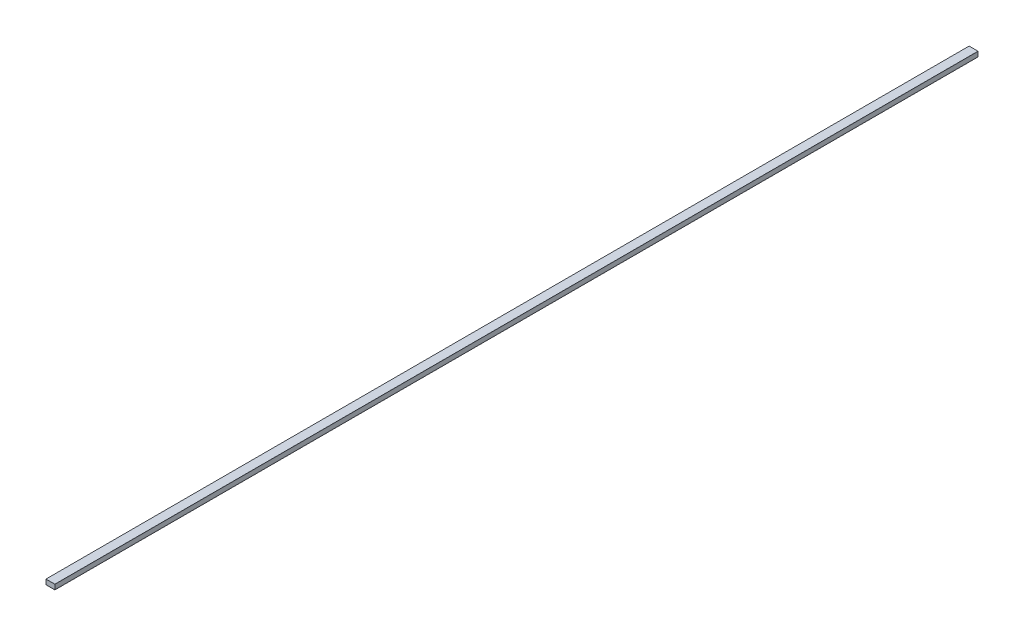
ISO-10303-21;
HEADER;
FILE_DESCRIPTION(('STEP AP214'),'2;1');
FILE_NAME('part.step','',(''),(''),'','','');
FILE_SCHEMA(('AUTOMOTIVE_DESIGN { 1 0 10303 214 1 1 1 1 }'));
ENDSEC;
DATA;
#1=APPLICATION_CONTEXT('core data for automotive mechanical design processes');
#2=APPLICATION_PROTOCOL_DEFINITION('international standard','automotive_design',2000,#1);
#3=PRODUCT_CONTEXT('',#1,'mechanical');
#4=PRODUCT('Part','Part','',(#3));
#5=PRODUCT_RELATED_PRODUCT_CATEGORY('part','',(#4));
#6=PRODUCT_DEFINITION_FORMATION('','',#4);
#7=PRODUCT_DEFINITION_CONTEXT('part definition',#1,'design');
#8=PRODUCT_DEFINITION('design','',#6,#7);
#9=PRODUCT_DEFINITION_SHAPE('','',#8);
#10=(LENGTH_UNIT() NAMED_UNIT(*) SI_UNIT(.MILLI.,.METRE.));
#11=(NAMED_UNIT(*) PLANE_ANGLE_UNIT() SI_UNIT($,.RADIAN.));
#12=(NAMED_UNIT(*) SI_UNIT($,.STERADIAN.) SOLID_ANGLE_UNIT());
#13=UNCERTAINTY_MEASURE_WITH_UNIT(LENGTH_MEASURE(1.E-05),#10,'distance_accuracy_value','');
#14=(GEOMETRIC_REPRESENTATION_CONTEXT(3) GLOBAL_UNCERTAINTY_ASSIGNED_CONTEXT((#13)) GLOBAL_UNIT_ASSIGNED_CONTEXT((#10,
#11,#12)) REPRESENTATION_CONTEXT('',''));
#15=CARTESIAN_POINT('',(0.,0.,0.));
#16=DIRECTION('',(0.,0.,1.));
#17=DIRECTION('',(1.,0.,0.));
#18=AXIS2_PLACEMENT_3D('',#15,#16,#17);
#19=CARTESIAN_POINT('',(-3.175,-1.787500108,329.946));
#20=DIRECTION('',(1.,0.,0.));
#21=DIRECTION('',(0.,1.,0.));
#22=AXIS2_PLACEMENT_3D('',#19,#20,#21);
#23=PLANE('',#22);
#24=DIRECTION('',(0.,-1.,0.));
#25=VECTOR('',#24,1.);
#26=CARTESIAN_POINT('',(-3.175,-1.787500108,-329.946));
#27=LINE('',#26,#25);
#28=CARTESIAN_POINT('',(-3.175,-1.5875,-329.946));
#29=VERTEX_POINT('',#28);
#30=CARTESIAN_POINT('',(-3.175,-1.787500108,-329.946));
#31=VERTEX_POINT('',#30);
#32=EDGE_CURVE('E104',#29,#31,#27,.T.);
#33=ORIENTED_EDGE('',*,*,#32,.T.);
#34=DIRECTION('',(0.,0.,-1.));
#35=VECTOR('',#34,1.);
#36=CARTESIAN_POINT('',(-3.175,-1.787500108,329.946));
#37=LINE('',#36,#35);
#38=CARTESIAN_POINT('',(-3.175,-1.787500108,329.946));
#39=VERTEX_POINT('',#38);
#40=EDGE_CURVE('E58',#39,#31,#37,.T.);
#41=ORIENTED_EDGE('',*,*,#40,.F.);
#42=DIRECTION('',(0.,-1.,0.));
#43=VECTOR('',#42,1.);
#44=CARTESIAN_POINT('',(-3.175,-1.787500108,329.946));
#45=LINE('',#44,#43);
#46=CARTESIAN_POINT('',(-3.175,-1.5875,329.946));
#47=VERTEX_POINT('',#46);
#48=EDGE_CURVE('E97',#47,#39,#45,.T.);
#49=ORIENTED_EDGE('',*,*,#48,.F.);
#50=DIRECTION('',(0.,0.,-1.));
#51=VECTOR('',#50,1.);
#52=CARTESIAN_POINT('',(-3.175,-1.5875,329.946));
#53=LINE('',#52,#51);
#54=EDGE_CURVE('E12',#47,#29,#53,.T.);
#55=ORIENTED_EDGE('',*,*,#54,.T.);
#56=EDGE_LOOP('',(#33,#41,#49,#55));
#57=FACE_BOUND('',#56,.T.);
#58=ADVANCED_FACE('F50',(#57),#23,.F.);
#59=CARTESIAN_POINT('',(3.175,-1.787500108,329.946));
#60=DIRECTION('',(0.,1.,0.));
#61=DIRECTION('',(-1.,0.,0.));
#62=AXIS2_PLACEMENT_3D('',#59,#60,#61);
#63=PLANE('',#62);
#64=DIRECTION('',(1.,0.,0.));
#65=VECTOR('',#64,1.);
#66=CARTESIAN_POINT('',(3.175,-1.787500108,-329.946));
#67=LINE('',#66,#65);
#68=CARTESIAN_POINT('',(3.175,-1.787500108,-329.946));
#69=VERTEX_POINT('',#68);
#70=EDGE_CURVE('E84',#31,#69,#67,.T.);
#71=ORIENTED_EDGE('',*,*,#70,.T.);
#72=DIRECTION('',(0.,0.,-1.));
#73=VECTOR('',#72,1.);
#74=CARTESIAN_POINT('',(3.175,-1.787500108,329.946));
#75=LINE('',#74,#73);
#76=CARTESIAN_POINT('',(3.175,-1.787500108,329.946));
#77=VERTEX_POINT('',#76);
#78=EDGE_CURVE('E105',#77,#69,#75,.T.);
#79=ORIENTED_EDGE('',*,*,#78,.F.);
#80=DIRECTION('',(1.,0.,0.));
#81=VECTOR('',#80,1.);
#82=CARTESIAN_POINT('',(3.175,-1.787500108,329.946));
#83=LINE('',#82,#81);
#84=EDGE_CURVE('E101',#39,#77,#83,.T.);
#85=ORIENTED_EDGE('',*,*,#84,.F.);
#86=ORIENTED_EDGE('',*,*,#40,.T.);
#87=EDGE_LOOP('',(#71,#79,#85,#86));
#88=FACE_BOUND('',#87,.T.);
#89=ADVANCED_FACE('F106',(#88),#63,.F.);
#90=CARTESIAN_POINT('',(3.175,-1.5875,329.946));
#91=DIRECTION('',(-1.,0.,0.));
#92=DIRECTION('',(0.,0.,1.));
#93=AXIS2_PLACEMENT_3D('',#90,#91,#92);
#94=PLANE('',#93);
#95=DIRECTION('',(0.,1.,0.));
#96=VECTOR('',#95,1.);
#97=CARTESIAN_POINT('',(3.175,-1.5875,-329.946));
#98=LINE('',#97,#96);
#99=CARTESIAN_POINT('',(3.175,-1.5875,-329.946));
#100=VERTEX_POINT('',#99);
#101=EDGE_CURVE('E91',#69,#100,#98,.T.);
#102=ORIENTED_EDGE('',*,*,#101,.T.);
#103=DIRECTION('',(0.,0.,-1.));
#104=VECTOR('',#103,1.);
#105=CARTESIAN_POINT('',(3.175,-1.5875,329.946));
#106=LINE('',#105,#104);
#107=CARTESIAN_POINT('',(3.175,-1.5875,329.946));
#108=VERTEX_POINT('',#107);
#109=EDGE_CURVE('E110',#108,#100,#106,.T.);
#110=ORIENTED_EDGE('',*,*,#109,.F.);
#111=DIRECTION('',(0.,1.,0.));
#112=VECTOR('',#111,1.);
#113=CARTESIAN_POINT('',(3.175,-1.5875,329.946));
#114=LINE('',#113,#112);
#115=EDGE_CURVE('E108',#77,#108,#114,.T.);
#116=ORIENTED_EDGE('',*,*,#115,.F.);
#117=ORIENTED_EDGE('',*,*,#78,.T.);
#118=EDGE_LOOP('',(#102,#110,#116,#117));
#119=FACE_BOUND('',#118,.T.);
#120=ADVANCED_FACE('F120',(#119),#94,.F.);
#121=CARTESIAN_POINT('',(0.,-1.5875,329.946));
#122=DIRECTION('',(0.,-1.,0.));
#123=DIRECTION('',(1.,0.,0.));
#124=AXIS2_PLACEMENT_3D('',#121,#122,#123);
#125=PLANE('',#124);
#126=DIRECTION('',(-1.,0.,0.));
#127=VECTOR('',#126,1.);
#128=CARTESIAN_POINT('',(0.,-1.5875,-329.946));
#129=LINE('',#128,#127);
#130=EDGE_CURVE('E117',#100,#29,#129,.T.);
#131=ORIENTED_EDGE('',*,*,#130,.T.);
#132=ORIENTED_EDGE('',*,*,#54,.F.);
#133=DIRECTION('',(-1.,0.,0.));
#134=VECTOR('',#133,1.);
#135=CARTESIAN_POINT('',(-3.175,-1.5875,329.946));
#136=LINE('',#135,#134);
#137=EDGE_CURVE('E66',#108,#47,#136,.T.);
#138=ORIENTED_EDGE('',*,*,#137,.F.);
#139=ORIENTED_EDGE('',*,*,#109,.T.);
#140=EDGE_LOOP('',(#131,#132,#138,#139));
#141=FACE_BOUND('',#140,.T.);
#142=ADVANCED_FACE('F124',(#141),#125,.F.);
#143=CARTESIAN_POINT('',(0.,0.,329.946));
#144=DIRECTION('',(0.,0.,-1.));
#145=DIRECTION('',(-1.,0.,0.));
#146=AXIS2_PLACEMENT_3D('',#143,#144,#145);
#147=PLANE('',#146);
#148=ORIENTED_EDGE('',*,*,#137,.T.);
#149=ORIENTED_EDGE('',*,*,#48,.T.);
#150=ORIENTED_EDGE('',*,*,#84,.T.);
#151=ORIENTED_EDGE('',*,*,#115,.T.);
#152=EDGE_LOOP('',(#148,#149,#150,#151));
#153=FACE_BOUND('',#152,.T.);
#154=ADVANCED_FACE('F99',(#153),#147,.F.);
#155=CARTESIAN_POINT('',(0.,0.,-329.946));
#156=DIRECTION('',(0.,0.,-1.));
#157=DIRECTION('',(-1.,0.,0.));
#158=AXIS2_PLACEMENT_3D('',#155,#156,#157);
#159=PLANE('',#158);
#160=ORIENTED_EDGE('',*,*,#32,.F.);
#161=ORIENTED_EDGE('',*,*,#130,.F.);
#162=ORIENTED_EDGE('',*,*,#101,.F.);
#163=ORIENTED_EDGE('',*,*,#70,.F.);
#164=EDGE_LOOP('',(#160,#161,#162,#163));
#165=FACE_BOUND('',#164,.T.);
#166=ADVANCED_FACE('F123',(#165),#159,.T.);
#167=CLOSED_SHELL('',(#58,#89,#120,#142,#154,#166));
#168=MANIFOLD_SOLID_BREP('B2',#167);
#169=CARTESIAN_POINT('',(0.,1.5875,329.946));
#170=DIRECTION('',(0.,1.,0.));
#171=DIRECTION('',(-1.,0.,0.));
#172=AXIS2_PLACEMENT_3D('',#169,#170,#171);
#173=PLANE('',#172);
#174=DIRECTION('',(1.,0.,0.));
#175=VECTOR('',#174,1.);
#176=CARTESIAN_POINT('',(0.,1.5875,-329.946));
#177=LINE('',#176,#175);
#178=CARTESIAN_POINT('',(-3.175,1.5875,-329.946));
#179=VERTEX_POINT('',#178);
#180=CARTESIAN_POINT('',(3.175,1.5875,-329.946));
#181=VERTEX_POINT('',#180);
#182=EDGE_CURVE('E226',#179,#181,#177,.T.);
#183=ORIENTED_EDGE('',*,*,#182,.T.);
#184=DIRECTION('',(0.,0.,-1.));
#185=VECTOR('',#184,1.);
#186=CARTESIAN_POINT('',(3.175,1.5875,329.946));
#187=LINE('',#186,#185);
#188=CARTESIAN_POINT('',(3.175,1.5875,329.946));
#189=VERTEX_POINT('',#188);
#190=EDGE_CURVE('E48',#189,#181,#187,.T.);
#191=ORIENTED_EDGE('',*,*,#190,.F.);
#192=DIRECTION('',(1.,0.,0.));
#193=VECTOR('',#192,1.);
#194=CARTESIAN_POINT('',(-3.175,1.5875,329.946));
#195=LINE('',#194,#193);
#196=CARTESIAN_POINT('',(-3.175,1.5875,329.946));
#197=VERTEX_POINT('',#196);
#198=EDGE_CURVE('E231',#197,#189,#195,.T.);
#199=ORIENTED_EDGE('',*,*,#198,.F.);
#200=DIRECTION('',(0.,0.,-1.));
#201=VECTOR('',#200,1.);
#202=CARTESIAN_POINT('',(-3.175,1.5875,329.946));
#203=LINE('',#202,#201);
#204=EDGE_CURVE('E246',#197,#179,#203,.T.);
#205=ORIENTED_EDGE('',*,*,#204,.T.);
#206=EDGE_LOOP('',(#183,#191,#199,#205));
#207=FACE_BOUND('',#206,.T.);
#208=ADVANCED_FACE('F186',(#207),#173,.F.);
#209=CARTESIAN_POINT('',(3.175,1.5875,329.946));
#210=DIRECTION('',(-1.,0.,0.));
#211=DIRECTION('',(0.,0.,1.));
#212=AXIS2_PLACEMENT_3D('',#209,#210,#211);
#213=PLANE('',#212);
#214=DIRECTION('',(0.,1.,0.));
#215=VECTOR('',#214,1.);
#216=CARTESIAN_POINT('',(3.175,1.5875,-329.946));
#217=LINE('',#216,#215);
#218=CARTESIAN_POINT('',(3.175,1.787500108,-329.946));
#219=VERTEX_POINT('',#218);
#220=EDGE_CURVE('E242',#181,#219,#217,.T.);
#221=ORIENTED_EDGE('',*,*,#220,.T.);
#222=DIRECTION('',(0.,0.,-1.));
#223=VECTOR('',#222,1.);
#224=CARTESIAN_POINT('',(3.175,1.787500108,329.946));
#225=LINE('',#224,#223);
#226=CARTESIAN_POINT('',(3.175,1.787500108,329.946));
#227=VERTEX_POINT('',#226);
#228=EDGE_CURVE('E194',#227,#219,#225,.T.);
#229=ORIENTED_EDGE('',*,*,#228,.F.);
#230=DIRECTION('',(0.,1.,0.));
#231=VECTOR('',#230,1.);
#232=CARTESIAN_POINT('',(3.175,1.5875,329.946));
#233=LINE('',#232,#231);
#234=EDGE_CURVE('E234',#189,#227,#233,.T.);
#235=ORIENTED_EDGE('',*,*,#234,.F.);
#236=ORIENTED_EDGE('',*,*,#190,.T.);
#237=EDGE_LOOP('',(#221,#229,#235,#236));
#238=FACE_BOUND('',#237,.T.);
#239=ADVANCED_FACE('F241',(#238),#213,.F.);
#240=CARTESIAN_POINT('',(3.175,1.787500108,329.946));
#241=DIRECTION('',(0.,-1.,0.));
#242=DIRECTION('',(1.,0.,0.));
#243=AXIS2_PLACEMENT_3D('',#240,#241,#242);
#244=PLANE('',#243);
#245=DIRECTION('',(-1.,0.,0.));
#246=VECTOR('',#245,1.);
#247=CARTESIAN_POINT('',(3.175,1.787500108,-329.946));
#248=LINE('',#247,#246);
#249=CARTESIAN_POINT('',(-3.175,1.787500108,-329.946));
#250=VERTEX_POINT('',#249);
#251=EDGE_CURVE('E219',#219,#250,#248,.T.);
#252=ORIENTED_EDGE('',*,*,#251,.T.);
#253=DIRECTION('',(0.,0.,-1.));
#254=VECTOR('',#253,1.);
#255=CARTESIAN_POINT('',(-3.175,1.787500108,329.946));
#256=LINE('',#255,#254);
#257=CARTESIAN_POINT('',(-3.175,1.787500108,329.946));
#258=VERTEX_POINT('',#257);
#259=EDGE_CURVE('E243',#258,#250,#256,.T.);
#260=ORIENTED_EDGE('',*,*,#259,.F.);
#261=DIRECTION('',(-1.,0.,0.));
#262=VECTOR('',#261,1.);
#263=CARTESIAN_POINT('',(3.175,1.787500108,329.946));
#264=LINE('',#263,#262);
#265=EDGE_CURVE('E238',#227,#258,#264,.T.);
#266=ORIENTED_EDGE('',*,*,#265,.F.);
#267=ORIENTED_EDGE('',*,*,#228,.T.);
#268=EDGE_LOOP('',(#252,#260,#266,#267));
#269=FACE_BOUND('',#268,.T.);
#270=ADVANCED_FACE('F244',(#269),#244,.F.);
#271=CARTESIAN_POINT('',(-3.175,1.787500108,329.946));
#272=DIRECTION('',(1.,0.,0.));
#273=DIRECTION('',(0.,0.,-1.));
#274=AXIS2_PLACEMENT_3D('',#271,#272,#273);
#275=PLANE('',#274);
#276=DIRECTION('',(0.,-1.,0.));
#277=VECTOR('',#276,1.);
#278=CARTESIAN_POINT('',(-3.175,1.787500108,-329.946));
#279=LINE('',#278,#277);
#280=EDGE_CURVE('E253',#250,#179,#279,.T.);
#281=ORIENTED_EDGE('',*,*,#280,.T.);
#282=ORIENTED_EDGE('',*,*,#204,.F.);
#283=DIRECTION('',(0.,-1.,0.));
#284=VECTOR('',#283,1.);
#285=CARTESIAN_POINT('',(-3.175,1.787500108,329.946));
#286=LINE('',#285,#284);
#287=EDGE_CURVE('E202',#258,#197,#286,.T.);
#288=ORIENTED_EDGE('',*,*,#287,.F.);
#289=ORIENTED_EDGE('',*,*,#259,.T.);
#290=EDGE_LOOP('',(#281,#282,#288,#289));
#291=FACE_BOUND('',#290,.T.);
#292=ADVANCED_FACE('F258',(#291),#275,.F.);
#293=CARTESIAN_POINT('',(0.,0.,329.946));
#294=DIRECTION('',(0.,0.,1.));
#295=DIRECTION('',(1.,0.,0.));
#296=AXIS2_PLACEMENT_3D('',#293,#294,#295);
#297=PLANE('',#296);
#298=ORIENTED_EDGE('',*,*,#198,.T.);
#299=ORIENTED_EDGE('',*,*,#234,.T.);
#300=ORIENTED_EDGE('',*,*,#265,.T.);
#301=ORIENTED_EDGE('',*,*,#287,.T.);
#302=EDGE_LOOP('',(#298,#299,#300,#301));
#303=FACE_BOUND('',#302,.T.);
#304=ADVANCED_FACE('F236',(#303),#297,.T.);
#305=CARTESIAN_POINT('',(0.,0.,-329.946));
#306=DIRECTION('',(0.,0.,1.));
#307=DIRECTION('',(1.,0.,0.));
#308=AXIS2_PLACEMENT_3D('',#305,#306,#307);
#309=PLANE('',#308);
#310=ORIENTED_EDGE('',*,*,#182,.F.);
#311=ORIENTED_EDGE('',*,*,#280,.F.);
#312=ORIENTED_EDGE('',*,*,#251,.F.);
#313=ORIENTED_EDGE('',*,*,#220,.F.);
#314=EDGE_LOOP('',(#310,#311,#312,#313));
#315=FACE_BOUND('',#314,.T.);
#316=ADVANCED_FACE('F259',(#315),#309,.F.);
#317=CLOSED_SHELL('',(#208,#239,#270,#292,#304,#316));
#318=MANIFOLD_SOLID_BREP('B6',#317);
#319=CARTESIAN_POINT('',(3.175,1.5875,329.946));
#320=DIRECTION('',(-1.,0.,0.));
#321=DIRECTION('',(0.,-1.,0.));
#322=AXIS2_PLACEMENT_3D('',#319,#320,#321);
#323=PLANE('',#322);
#324=DIRECTION('',(0.,1.,0.));
#325=VECTOR('',#324,1.);
#326=CARTESIAN_POINT('',(3.175,1.5875,-329.946));
#327=LINE('',#326,#325);
#328=CARTESIAN_POINT('',(3.175,-1.5875,-329.946));
#329=VERTEX_POINT('',#328);
#330=CARTESIAN_POINT('',(3.175,1.5875,-329.946));
#331=VERTEX_POINT('',#330);
#332=EDGE_CURVE('E376',#329,#331,#327,.T.);
#333=ORIENTED_EDGE('',*,*,#332,.T.);
#334=DIRECTION('',(0.,0.,-1.));
#335=VECTOR('',#334,1.);
#336=CARTESIAN_POINT('',(3.175,1.5875,329.946));
#337=LINE('',#336,#335);
#338=CARTESIAN_POINT('',(3.175,1.5875,329.946));
#339=VERTEX_POINT('',#338);
#340=EDGE_CURVE('E184',#339,#331,#337,.T.);
#341=ORIENTED_EDGE('',*,*,#340,.F.);
#342=DIRECTION('',(0.,1.,0.));
#343=VECTOR('',#342,1.);
#344=CARTESIAN_POINT('',(3.175,1.5875,329.946));
#345=LINE('',#344,#343);
#346=CARTESIAN_POINT('',(3.175,-1.5875,329.946));
#347=VERTEX_POINT('',#346);
#348=EDGE_CURVE('E364',#347,#339,#345,.T.);
#349=ORIENTED_EDGE('',*,*,#348,.F.);
#350=DIRECTION('',(0.,0.,-1.));
#351=VECTOR('',#350,1.);
#352=CARTESIAN_POINT('',(3.175,-1.5875,329.946));
#353=LINE('',#352,#351);
#354=EDGE_CURVE('E372',#347,#329,#353,.T.);
#355=ORIENTED_EDGE('',*,*,#354,.T.);
#356=EDGE_LOOP('',(#333,#341,#349,#355));
#357=FACE_BOUND('',#356,.T.);
#358=ADVANCED_FACE('F313',(#357),#323,.F.);
#359=CARTESIAN_POINT('',(-3.175,1.5875,329.946));
#360=DIRECTION('',(0.,-1.,0.));
#361=DIRECTION('',(0.,0.,-1.));
#362=AXIS2_PLACEMENT_3D('',#359,#360,#361);
#363=PLANE('',#362);
#364=DIRECTION('',(-1.,0.,0.));
#365=VECTOR('',#364,1.);
#366=CARTESIAN_POINT('',(-3.175,1.5875,-329.946));
#367=LINE('',#366,#365);
#368=CARTESIAN_POINT('',(-3.175,1.5875,-329.946));
#369=VERTEX_POINT('',#368);
#370=EDGE_CURVE('E368',#331,#369,#367,.T.);
#371=ORIENTED_EDGE('',*,*,#370,.T.);
#372=DIRECTION('',(0.,0.,-1.));
#373=VECTOR('',#372,1.);
#374=CARTESIAN_POINT('',(-3.175,1.5875,329.946));
#375=LINE('',#374,#373);
#376=CARTESIAN_POINT('',(-3.175,1.5875,329.946));
#377=VERTEX_POINT('',#376);
#378=EDGE_CURVE('E321',#377,#369,#375,.T.);
#379=ORIENTED_EDGE('',*,*,#378,.F.);
#380=DIRECTION('',(-1.,0.,0.));
#381=VECTOR('',#380,1.);
#382=CARTESIAN_POINT('',(-3.175,1.5875,329.946));
#383=LINE('',#382,#381);
#384=EDGE_CURVE('E359',#339,#377,#383,.T.);
#385=ORIENTED_EDGE('',*,*,#384,.F.);
#386=ORIENTED_EDGE('',*,*,#340,.T.);
#387=EDGE_LOOP('',(#371,#379,#385,#386));
#388=FACE_BOUND('',#387,.T.);
#389=ADVANCED_FACE('F367',(#388),#363,.F.);
#390=CARTESIAN_POINT('',(-3.175,1.5875,329.946));
#391=DIRECTION('',(1.,0.,0.));
#392=DIRECTION('',(0.,1.,0.));
#393=AXIS2_PLACEMENT_3D('',#390,#391,#392);
#394=PLANE('',#393);
#395=DIRECTION('',(0.,-1.,0.));
#396=VECTOR('',#395,1.);
#397=CARTESIAN_POINT('',(-3.175,1.5875,-329.946));
#398=LINE('',#397,#396);
#399=CARTESIAN_POINT('',(-3.175,-1.5875,-329.946));
#400=VERTEX_POINT('',#399);
#401=EDGE_CURVE('E346',#369,#400,#398,.T.);
#402=ORIENTED_EDGE('',*,*,#401,.T.);
#403=DIRECTION('',(0.,0.,-1.));
#404=VECTOR('',#403,1.);
#405=CARTESIAN_POINT('',(-3.175,-1.5875,329.946));
#406=LINE('',#405,#404);
#407=CARTESIAN_POINT('',(-3.175,-1.5875,329.946));
#408=VERTEX_POINT('',#407);
#409=EDGE_CURVE('E369',#408,#400,#406,.T.);
#410=ORIENTED_EDGE('',*,*,#409,.F.);
#411=DIRECTION('',(0.,-1.,0.));
#412=VECTOR('',#411,1.);
#413=CARTESIAN_POINT('',(-3.175,1.5875,329.946));
#414=LINE('',#413,#412);
#415=EDGE_CURVE('E362',#377,#408,#414,.T.);
#416=ORIENTED_EDGE('',*,*,#415,.F.);
#417=ORIENTED_EDGE('',*,*,#378,.T.);
#418=EDGE_LOOP('',(#402,#410,#416,#417));
#419=FACE_BOUND('',#418,.T.);
#420=ADVANCED_FACE('F370',(#419),#394,.F.);
#421=CARTESIAN_POINT('',(-3.175,-1.5875,329.946));
#422=DIRECTION('',(0.,1.,0.));
#423=DIRECTION('',(0.,0.,1.));
#424=AXIS2_PLACEMENT_3D('',#421,#422,#423);
#425=PLANE('',#424);
#426=DIRECTION('',(1.,0.,0.));
#427=VECTOR('',#426,1.);
#428=CARTESIAN_POINT('',(-3.175,-1.5875,-329.946));
#429=LINE('',#428,#427);
#430=EDGE_CURVE('E352',#400,#329,#429,.T.);
#431=ORIENTED_EDGE('',*,*,#430,.T.);
#432=ORIENTED_EDGE('',*,*,#354,.F.);
#433=DIRECTION('',(1.,0.,0.));
#434=VECTOR('',#433,1.);
#435=CARTESIAN_POINT('',(-3.175,-1.5875,329.946));
#436=LINE('',#435,#434);
#437=EDGE_CURVE('E329',#408,#347,#436,.T.);
#438=ORIENTED_EDGE('',*,*,#437,.F.);
#439=ORIENTED_EDGE('',*,*,#409,.T.);
#440=EDGE_LOOP('',(#431,#432,#438,#439));
#441=FACE_BOUND('',#440,.T.);
#442=ADVANCED_FACE('F383',(#441),#425,.F.);
#443=CARTESIAN_POINT('',(0.,0.,329.946));
#444=DIRECTION('',(0.,0.,1.));
#445=DIRECTION('',(1.,0.,0.));
#446=AXIS2_PLACEMENT_3D('',#443,#444,#445);
#447=PLANE('',#446);
#448=ORIENTED_EDGE('',*,*,#348,.T.);
#449=ORIENTED_EDGE('',*,*,#384,.T.);
#450=ORIENTED_EDGE('',*,*,#415,.T.);
#451=ORIENTED_EDGE('',*,*,#437,.T.);
#452=EDGE_LOOP('',(#448,#449,#450,#451));
#453=FACE_BOUND('',#452,.T.);
#454=ADVANCED_FACE('F360',(#453),#447,.T.);
#455=CARTESIAN_POINT('',(0.,0.,-329.946));
#456=DIRECTION('',(0.,0.,1.));
#457=DIRECTION('',(1.,0.,0.));
#458=AXIS2_PLACEMENT_3D('',#455,#456,#457);
#459=PLANE('',#458);
#460=ORIENTED_EDGE('',*,*,#332,.F.);
#461=ORIENTED_EDGE('',*,*,#430,.F.);
#462=ORIENTED_EDGE('',*,*,#401,.F.);
#463=ORIENTED_EDGE('',*,*,#370,.F.);
#464=EDGE_LOOP('',(#460,#461,#462,#463));
#465=FACE_BOUND('',#464,.T.);
#466=ADVANCED_FACE('F386',(#465),#459,.F.);
#467=CLOSED_SHELL('',(#358,#389,#420,#442,#454,#466));
#468=MANIFOLD_SOLID_BREP('B42',#467);
#469=ADVANCED_BREP_SHAPE_REPRESENTATION('',(#18,#168,#318,#468),#14);
#470=SHAPE_DEFINITION_REPRESENTATION(#9,#469);
ENDSEC;
END-ISO-10303-21;
